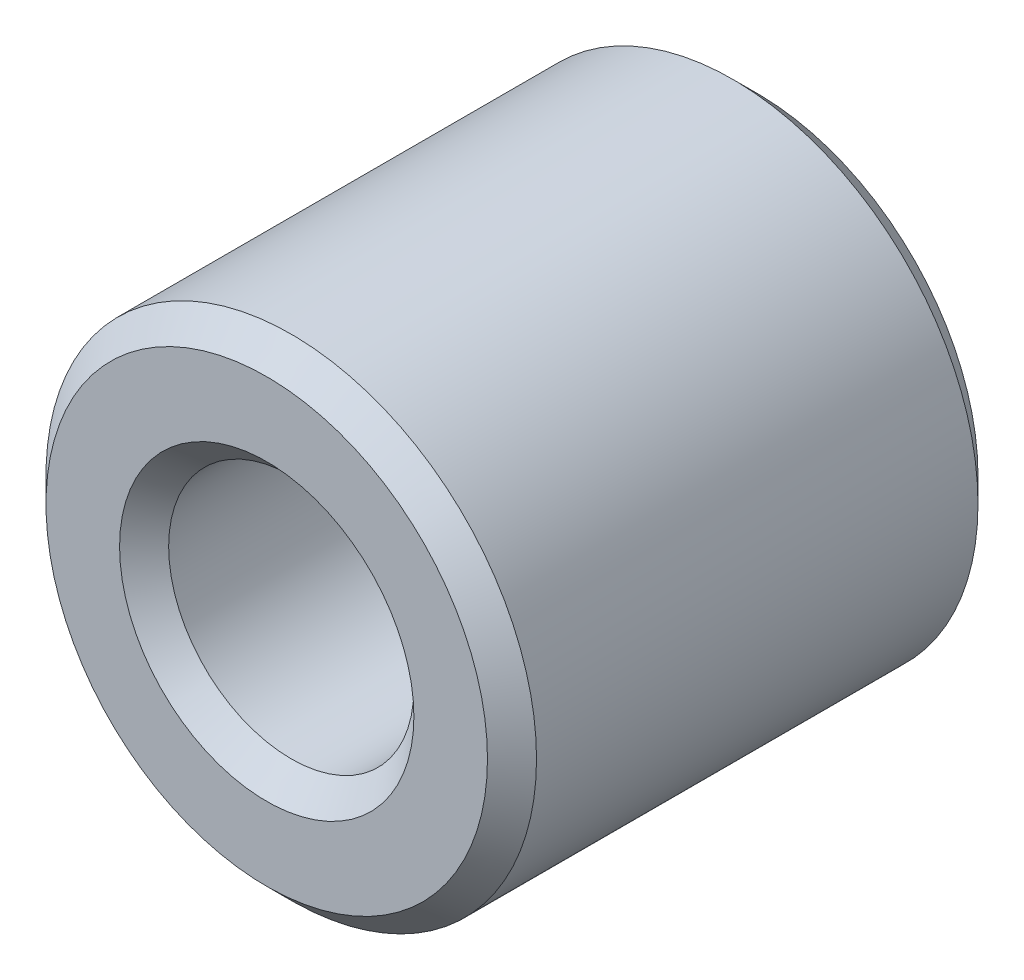
ISO-10303-21;
HEADER;
FILE_DESCRIPTION(('STEP AP214'),'2;1');
FILE_NAME('part.step','',(''),(''),'','','');
FILE_SCHEMA(('AUTOMOTIVE_DESIGN { 1 0 10303 214 1 1 1 1 }'));
ENDSEC;
DATA;
#1=APPLICATION_CONTEXT('core data for automotive mechanical design processes');
#2=APPLICATION_PROTOCOL_DEFINITION('international standard','automotive_design',2000,#1);
#3=PRODUCT_CONTEXT('',#1,'mechanical');
#4=PRODUCT('Part','Part','',(#3));
#5=PRODUCT_RELATED_PRODUCT_CATEGORY('part','',(#4));
#6=PRODUCT_DEFINITION_FORMATION('','',#4);
#7=PRODUCT_DEFINITION_CONTEXT('part definition',#1,'design');
#8=PRODUCT_DEFINITION('design','',#6,#7);
#9=PRODUCT_DEFINITION_SHAPE('','',#8);
#10=(LENGTH_UNIT() NAMED_UNIT(*) SI_UNIT(.MILLI.,.METRE.));
#11=(NAMED_UNIT(*) PLANE_ANGLE_UNIT() SI_UNIT($,.RADIAN.));
#12=(NAMED_UNIT(*) SI_UNIT($,.STERADIAN.) SOLID_ANGLE_UNIT());
#13=UNCERTAINTY_MEASURE_WITH_UNIT(LENGTH_MEASURE(1.E-05),#10,'distance_accuracy_value','');
#14=(GEOMETRIC_REPRESENTATION_CONTEXT(3) GLOBAL_UNCERTAINTY_ASSIGNED_CONTEXT((#13)) GLOBAL_UNIT_ASSIGNED_CONTEXT((#10,
#11,#12)) REPRESENTATION_CONTEXT('',''));
#15=CARTESIAN_POINT('',(0.,0.,0.));
#16=DIRECTION('',(0.,0.,1.));
#17=DIRECTION('',(1.,0.,0.));
#18=AXIS2_PLACEMENT_3D('',#15,#16,#17);
#19=CARTESIAN_POINT('',(0.,0.,6.));
#20=DIRECTION('',(0.,0.,1.));
#21=DIRECTION('',(1.,0.,0.));
#22=AXIS2_PLACEMENT_3D('',#19,#20,#21);
#23=PLANE('',#22);
#24=CARTESIAN_POINT('',(0.,0.,6.));
#25=DIRECTION('',(0.,0.,1.));
#26=DIRECTION('',(1.,0.,0.));
#27=AXIS2_PLACEMENT_3D('',#24,#25,#26);
#28=CIRCLE('',#27,2.7);
#29=CARTESIAN_POINT('',(2.7,0.,6.));
#30=VERTEX_POINT('',#29);
#31=EDGE_CURVE('E10',#30,#30,#28,.T.);
#32=ORIENTED_EDGE('',*,*,#31,.T.);
#33=EDGE_LOOP('',(#32));
#34=FACE_BOUND('',#33,.T.);
#35=CARTESIAN_POINT('',(0.,0.,6.));
#36=DIRECTION('',(0.,0.,1.));
#37=DIRECTION('',(1.,0.,0.));
#38=AXIS2_PLACEMENT_3D('',#35,#36,#37);
#39=CIRCLE('',#38,1.8);
#40=CARTESIAN_POINT('',(1.8,0.,6.));
#41=VERTEX_POINT('',#40);
#42=EDGE_CURVE('E38',#41,#41,#39,.F.);
#43=ORIENTED_EDGE('',*,*,#42,.T.);
#44=EDGE_LOOP('',(#43));
#45=FACE_BOUND('',#44,.T.);
#46=ADVANCED_FACE('F31',(#34,#45),#23,.T.);
#47=CARTESIAN_POINT('',(0.,0.,0.));
#48=DIRECTION('',(0.,0.,1.));
#49=DIRECTION('',(1.,0.,0.));
#50=AXIS2_PLACEMENT_3D('',#47,#48,#49);
#51=PLANE('',#50);
#52=CARTESIAN_POINT('',(0.,0.,0.));
#53=DIRECTION('',(0.,0.,1.));
#54=DIRECTION('',(1.,0.,0.));
#55=AXIS2_PLACEMENT_3D('',#52,#53,#54);
#56=CIRCLE('',#55,1.8);
#57=CARTESIAN_POINT('',(1.8,0.,0.));
#58=VERTEX_POINT('',#57);
#59=EDGE_CURVE('E57',#58,#58,#56,.T.);
#60=ORIENTED_EDGE('',*,*,#59,.T.);
#61=EDGE_LOOP('',(#60));
#62=FACE_BOUND('',#61,.T.);
#63=CARTESIAN_POINT('',(0.,0.,0.));
#64=DIRECTION('',(0.,0.,1.));
#65=DIRECTION('',(1.,0.,0.));
#66=AXIS2_PLACEMENT_3D('',#63,#64,#65);
#67=CIRCLE('',#66,2.7);
#68=CARTESIAN_POINT('',(2.7,0.,0.));
#69=VERTEX_POINT('',#68);
#70=EDGE_CURVE('E60',#69,#69,#67,.F.);
#71=ORIENTED_EDGE('',*,*,#70,.T.);
#72=EDGE_LOOP('',(#71));
#73=FACE_BOUND('',#72,.T.);
#74=ADVANCED_FACE('F64',(#62,#73),#51,.F.);
#75=CARTESIAN_POINT('',(0.,0.,6.));
#76=DIRECTION('',(0.,0.,-1.));
#77=DIRECTION('',(-1.,0.,0.));
#78=AXIS2_PLACEMENT_3D('',#75,#76,#77);
#79=CYLINDRICAL_SURFACE('',#78,3.);
#80=CARTESIAN_POINT('',(0.,0.,0.300000000000001));
#81=DIRECTION('',(0.,0.,1.));
#82=DIRECTION('',(1.,0.,0.));
#83=AXIS2_PLACEMENT_3D('',#80,#81,#82);
#84=CIRCLE('',#83,3.);
#85=CARTESIAN_POINT('',(3.,0.,0.300000000000001));
#86=VERTEX_POINT('',#85);
#87=EDGE_CURVE('E42',#86,#86,#84,.T.);
#88=ORIENTED_EDGE('',*,*,#87,.T.);
#89=EDGE_LOOP('',(#88));
#90=FACE_BOUND('',#89,.T.);
#91=CARTESIAN_POINT('',(0.,0.,5.7));
#92=DIRECTION('',(0.,0.,1.));
#93=DIRECTION('',(1.,0.,0.));
#94=AXIS2_PLACEMENT_3D('',#91,#92,#93);
#95=CIRCLE('',#94,3.);
#96=CARTESIAN_POINT('',(3.,0.,5.7));
#97=VERTEX_POINT('',#96);
#98=EDGE_CURVE('E46',#97,#97,#95,.F.);
#99=ORIENTED_EDGE('',*,*,#98,.T.);
#100=EDGE_LOOP('',(#99));
#101=FACE_BOUND('',#100,.T.);
#102=ADVANCED_FACE('F74',(#90,#101),#79,.T.);
#103=CARTESIAN_POINT('',(0.,0.,6.));
#104=DIRECTION('',(0.,0.,-1.));
#105=DIRECTION('',(-1.,0.,0.));
#106=AXIS2_PLACEMENT_3D('',#103,#104,#105);
#107=CYLINDRICAL_SURFACE('',#106,1.5);
#108=CARTESIAN_POINT('',(0.,0.,0.300000000000002));
#109=DIRECTION('',(0.,0.,1.));
#110=DIRECTION('',(1.,0.,0.));
#111=AXIS2_PLACEMENT_3D('',#108,#109,#110);
#112=CIRCLE('',#111,1.5);
#113=CARTESIAN_POINT('',(1.5,0.,0.300000000000002));
#114=VERTEX_POINT('',#113);
#115=EDGE_CURVE('E51',#114,#114,#112,.F.);
#116=ORIENTED_EDGE('',*,*,#115,.T.);
#117=EDGE_LOOP('',(#116));
#118=FACE_BOUND('',#117,.T.);
#119=CARTESIAN_POINT('',(0.,0.,5.7));
#120=DIRECTION('',(0.,0.,1.));
#121=DIRECTION('',(1.,0.,0.));
#122=AXIS2_PLACEMENT_3D('',#119,#120,#121);
#123=CIRCLE('',#122,1.5);
#124=CARTESIAN_POINT('',(1.5,0.,5.7));
#125=VERTEX_POINT('',#124);
#126=EDGE_CURVE('E54',#125,#125,#123,.T.);
#127=ORIENTED_EDGE('',*,*,#126,.T.);
#128=EDGE_LOOP('',(#127));
#129=FACE_BOUND('',#128,.T.);
#130=ADVANCED_FACE('F77',(#118,#129),#107,.F.);
#131=CARTESIAN_POINT('',(0.,0.,0.));
#132=DIRECTION('',(0.,0.,-1.));
#133=DIRECTION('',(-1.,0.,0.));
#134=AXIS2_PLACEMENT_3D('',#131,#132,#133);
#135=CONICAL_SURFACE('',#134,1.8,0.785398163397445);
#136=ORIENTED_EDGE('',*,*,#115,.F.);
#137=EDGE_LOOP('',(#136));
#138=FACE_BOUND('',#137,.T.);
#139=ORIENTED_EDGE('',*,*,#59,.F.);
#140=EDGE_LOOP('',(#139));
#141=FACE_BOUND('',#140,.T.);
#142=ADVANCED_FACE('F70',(#138,#141),#135,.F.);
#143=CARTESIAN_POINT('',(0.,0.,0.300000000000001));
#144=DIRECTION('',(0.,0.,1.));
#145=DIRECTION('',(1.,0.,0.));
#146=AXIS2_PLACEMENT_3D('',#143,#144,#145);
#147=CONICAL_SURFACE('',#146,3.,0.785398163397451);
#148=CARTESIAN_POINT('',(2.7,0.,0.));
#149=CARTESIAN_POINT('',(2.703125,0.,0.00312500000000003));
#150=CARTESIAN_POINT('',(2.70625,0.,0.00625000000000004));
#151=CARTESIAN_POINT('',(2.7125,0.,0.0125));
#152=CARTESIAN_POINT('',(2.715625,0.,0.015625));
#153=CARTESIAN_POINT('',(2.721875,0.,0.021875));
#154=CARTESIAN_POINT('',(2.725,0.,0.025));
#155=CARTESIAN_POINT('',(2.73125,0.,0.03125));
#156=CARTESIAN_POINT('',(2.734375,0.,0.0343750000000001));
#157=CARTESIAN_POINT('',(2.740625,0.,0.0406250000000001));
#158=CARTESIAN_POINT('',(2.74375,0.,0.04375));
#159=CARTESIAN_POINT('',(2.75,0.,0.0500000000000001));
#160=CARTESIAN_POINT('',(2.753125,0.,0.0531250000000001));
#161=CARTESIAN_POINT('',(2.759375,0.,0.0593750000000001));
#162=CARTESIAN_POINT('',(2.7625,0.,0.0625000000000001));
#163=CARTESIAN_POINT('',(2.76875,0.,0.0687500000000001));
#164=CARTESIAN_POINT('',(2.771875,0.,0.0718750000000001));
#165=CARTESIAN_POINT('',(2.778125,0.,0.0781250000000002));
#166=CARTESIAN_POINT('',(2.78125,0.,0.0812500000000002));
#167=CARTESIAN_POINT('',(2.7875,0.,0.0875000000000001));
#168=CARTESIAN_POINT('',(2.790625,0.,0.0906250000000001));
#169=CARTESIAN_POINT('',(2.796875,0.,0.0968750000000002));
#170=CARTESIAN_POINT('',(2.8,0.,0.1));
#171=CARTESIAN_POINT('',(2.80625,0.,0.10625));
#172=CARTESIAN_POINT('',(2.809375,0.,0.109375));
#173=CARTESIAN_POINT('',(2.815625,0.,0.115625));
#174=CARTESIAN_POINT('',(2.81875,0.,0.11875));
#175=CARTESIAN_POINT('',(2.825,0.,0.125));
#176=CARTESIAN_POINT('',(2.828125,0.,0.128125));
#177=CARTESIAN_POINT('',(2.834375,0.,0.134375));
#178=CARTESIAN_POINT('',(2.8375,0.,0.1375));
#179=CARTESIAN_POINT('',(2.84375,0.,0.14375));
#180=CARTESIAN_POINT('',(2.846875,0.,0.146875));
#181=CARTESIAN_POINT('',(2.853125,0.,0.153125));
#182=CARTESIAN_POINT('',(2.85625,0.,0.15625));
#183=CARTESIAN_POINT('',(2.8625,0.,0.1625));
#184=CARTESIAN_POINT('',(2.865625,0.,0.165625));
#185=CARTESIAN_POINT('',(2.871875,0.,0.171875));
#186=CARTESIAN_POINT('',(2.875,0.,0.175));
#187=CARTESIAN_POINT('',(2.88125,0.,0.18125));
#188=CARTESIAN_POINT('',(2.884375,0.,0.184375));
#189=CARTESIAN_POINT('',(2.890625,0.,0.190625));
#190=CARTESIAN_POINT('',(2.89375,0.,0.19375));
#191=CARTESIAN_POINT('',(2.9,0.,0.2));
#192=CARTESIAN_POINT('',(2.903125,0.,0.203125));
#193=CARTESIAN_POINT('',(2.909375,0.,0.209375000000001));
#194=CARTESIAN_POINT('',(2.9125,0.,0.2125));
#195=CARTESIAN_POINT('',(2.91875,0.,0.21875));
#196=CARTESIAN_POINT('',(2.921875,0.,0.221875000000001));
#197=CARTESIAN_POINT('',(2.928125,0.,0.228125000000001));
#198=CARTESIAN_POINT('',(2.93125,0.,0.231250000000001));
#199=CARTESIAN_POINT('',(2.9375,0.,0.237500000000001));
#200=CARTESIAN_POINT('',(2.940625,0.,0.240625000000001));
#201=CARTESIAN_POINT('',(2.946875,0.,0.246875000000001));
#202=CARTESIAN_POINT('',(2.95,0.,0.250000000000001));
#203=CARTESIAN_POINT('',(2.95625,0.,0.256250000000001));
#204=CARTESIAN_POINT('',(2.959375,0.,0.259375000000001));
#205=CARTESIAN_POINT('',(2.965625,0.,0.265625000000001));
#206=CARTESIAN_POINT('',(2.96875,0.,0.268750000000001));
#207=CARTESIAN_POINT('',(2.975,0.,0.275000000000001));
#208=CARTESIAN_POINT('',(2.978125,0.,0.278125000000001));
#209=CARTESIAN_POINT('',(2.984375,0.,0.284375000000001));
#210=CARTESIAN_POINT('',(2.9875,0.,0.287500000000001));
#211=CARTESIAN_POINT('',(2.99375,0.,0.293750000000001));
#212=CARTESIAN_POINT('',(2.996875,0.,0.296875000000001));
#213=CARTESIAN_POINT('',(3.,0.,0.300000000000001));
#214=B_SPLINE_CURVE_WITH_KNOTS('',3,(#148,#149,#150,#151,#152,#153,#154,#155,#156,#157,#158,
#159,#160,#161,#162,#163,#164,#165,#166,#167,#168,#169,#170,#171,#172,#173,#174,#175,#176,#177,
#178,#179,#180,#181,#182,#183,#184,#185,#186,#187,#188,#189,#190,#191,#192,#193,#194,#195,#196,
#197,#198,#199,#200,#201,#202,#203,#204,#205,#206,#207,#208,#209,#210,#211,#212,#213),
.UNSPECIFIED.,.F.,.F.,(4,2,2,2,2,2,2,2,2,2,2,2,2,2,2,2,2,2,2,2,2,2,2,2,2,2,2,2,2,2,2,2,4),(0.,
0.0132582521472477,0.0265165042944956,0.0397747564417436,0.0530330085889913,0.0662912607362393,
0.0795495128834869,0.0928077650307349,0.106066017177983,0.119324269325231,0.132582521472478,
0.145840773619726,0.159099025766974,0.172357277914222,0.18561553006147,0.198873782208717,
0.212132034355965,0.225390286503213,0.238648538650461,0.251906790797709,0.265165042944957,
0.278423295092205,0.291681547239452,0.3049397993867,0.318198051533948,0.331456303681196,
0.344714555828444,0.357972807975692,0.37123106012294,0.384489312270187,0.397747564417435,
0.411005816564683,0.424264068711931),.UNSPECIFIED.);
#215=EDGE_CURVE('BSEAM66',#69,#86,#214,.T.);
#216=ORIENTED_EDGE('',*,*,#70,.F.);
#217=ORIENTED_EDGE('',*,*,#87,.F.);
#218=ORIENTED_EDGE('',*,*,#215,.T.);
#219=ORIENTED_EDGE('',*,*,#215,.F.);
#220=EDGE_LOOP('',(#216,#218,#217,#219));
#221=FACE_BOUND('',#220,.T.);
#222=ADVANCED_FACE('F66',(#221),#147,.T.);
#223=CARTESIAN_POINT('',(0.,0.,6.));
#224=DIRECTION('',(0.,0.,-1.));
#225=DIRECTION('',(-1.,0.,0.));
#226=AXIS2_PLACEMENT_3D('',#223,#224,#225);
#227=CONICAL_SURFACE('',#226,2.7,0.785398163397447);
#228=ORIENTED_EDGE('',*,*,#98,.F.);
#229=EDGE_LOOP('',(#228));
#230=FACE_BOUND('',#229,.T.);
#231=ORIENTED_EDGE('',*,*,#31,.F.);
#232=EDGE_LOOP('',(#231));
#233=FACE_BOUND('',#232,.T.);
#234=ADVANCED_FACE('F69',(#230,#233),#227,.T.);
#235=CARTESIAN_POINT('',(0.,0.,5.7));
#236=DIRECTION('',(0.,0.,1.));
#237=DIRECTION('',(1.,0.,0.));
#238=AXIS2_PLACEMENT_3D('',#235,#236,#237);
#239=CONICAL_SURFACE('',#238,1.5,0.785398163397451);
#240=ORIENTED_EDGE('',*,*,#42,.F.);
#241=EDGE_LOOP('',(#240));
#242=FACE_BOUND('',#241,.T.);
#243=ORIENTED_EDGE('',*,*,#126,.F.);
#244=EDGE_LOOP('',(#243));
#245=FACE_BOUND('',#244,.T.);
#246=ADVANCED_FACE('F33',(#242,#245),#239,.F.);
#247=CLOSED_SHELL('',(#46,#74,#102,#130,#142,#222,#234,#246));
#248=MANIFOLD_SOLID_BREP('B2',#247);
#249=ADVANCED_BREP_SHAPE_REPRESENTATION('',(#18,#248),#14);
#250=SHAPE_DEFINITION_REPRESENTATION(#9,#249);
ENDSEC;
END-ISO-10303-21;
